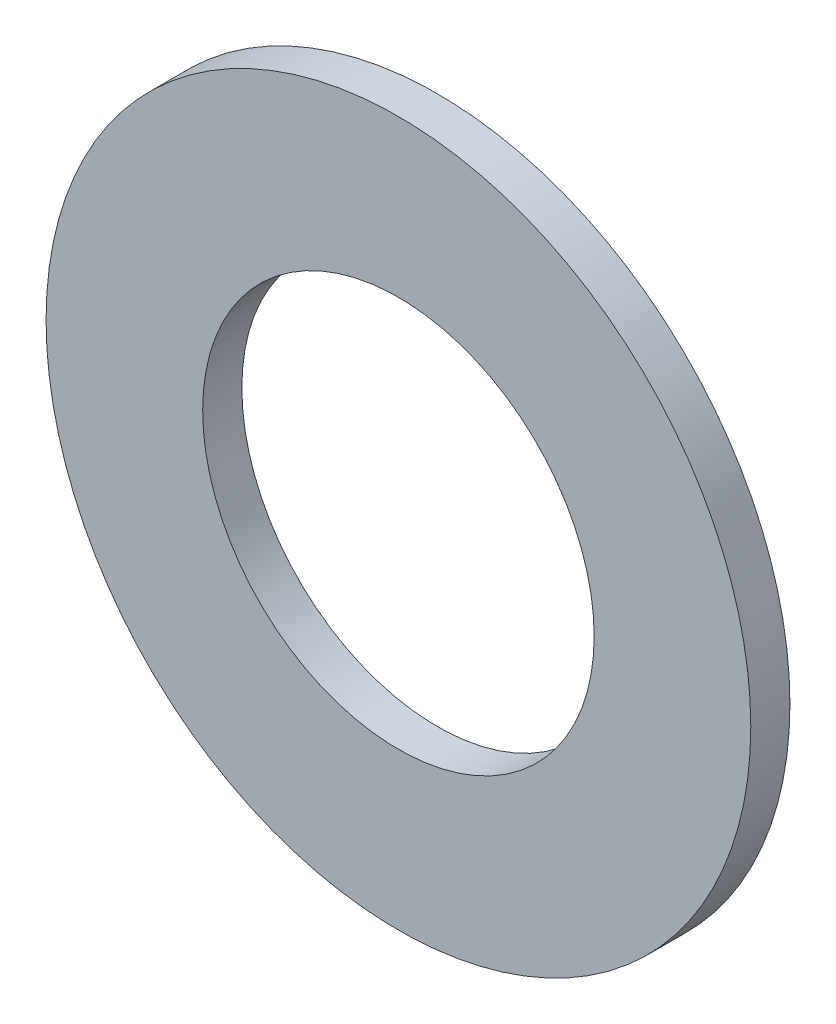
ISO-10303-21;
HEADER;
FILE_DESCRIPTION(('STEP AP214'),'2;1');
FILE_NAME('part.step','',(''),(''),'','','');
FILE_SCHEMA(('AUTOMOTIVE_DESIGN { 1 0 10303 214 1 1 1 1 }'));
ENDSEC;
DATA;
#1=APPLICATION_CONTEXT('core data for automotive mechanical design processes');
#2=APPLICATION_PROTOCOL_DEFINITION('international standard','automotive_design',2000,#1);
#3=PRODUCT_CONTEXT('',#1,'mechanical');
#4=PRODUCT('Part','Part','',(#3));
#5=PRODUCT_RELATED_PRODUCT_CATEGORY('part','',(#4));
#6=PRODUCT_DEFINITION_FORMATION('','',#4);
#7=PRODUCT_DEFINITION_CONTEXT('part definition',#1,'design');
#8=PRODUCT_DEFINITION('design','',#6,#7);
#9=PRODUCT_DEFINITION_SHAPE('','',#8);
#10=(LENGTH_UNIT() NAMED_UNIT(*) SI_UNIT(.MILLI.,.METRE.));
#11=(NAMED_UNIT(*) PLANE_ANGLE_UNIT() SI_UNIT($,.RADIAN.));
#12=(NAMED_UNIT(*) SI_UNIT($,.STERADIAN.) SOLID_ANGLE_UNIT());
#13=UNCERTAINTY_MEASURE_WITH_UNIT(LENGTH_MEASURE(1.E-05),#10,'distance_accuracy_value','');
#14=(GEOMETRIC_REPRESENTATION_CONTEXT(3) GLOBAL_UNCERTAINTY_ASSIGNED_CONTEXT((#13)) GLOBAL_UNIT_ASSIGNED_CONTEXT((#10,
#11,#12)) REPRESENTATION_CONTEXT('',''));
#15=CARTESIAN_POINT('',(0.,0.,0.));
#16=DIRECTION('',(0.,0.,1.));
#17=DIRECTION('',(1.,0.,0.));
#18=AXIS2_PLACEMENT_3D('',#15,#16,#17);
#19=CARTESIAN_POINT('',(0.,0.,-0.25));
#20=DIRECTION('',(0.,0.,1.));
#21=DIRECTION('',(1.,0.,0.));
#22=AXIS2_PLACEMENT_3D('',#19,#20,#21);
#23=PLANE('',#22);
#24=CARTESIAN_POINT('',(0.,0.,-0.25));
#25=DIRECTION('',(0.,0.,-1.));
#26=DIRECTION('',(-1.,0.,0.));
#27=AXIS2_PLACEMENT_3D('',#24,#25,#26);
#28=CIRCLE('',#27,2.5);
#29=CARTESIAN_POINT('',(-2.5,0.,-0.25));
#30=VERTEX_POINT('',#29);
#31=EDGE_CURVE('E26',#30,#30,#28,.F.);
#32=ORIENTED_EDGE('',*,*,#31,.T.);
#33=EDGE_LOOP('',(#32));
#34=FACE_BOUND('',#33,.T.);
#35=CARTESIAN_POINT('',(0.,0.,-0.25));
#36=DIRECTION('',(0.,0.,-1.));
#37=DIRECTION('',(-1.,0.,0.));
#38=AXIS2_PLACEMENT_3D('',#35,#36,#37);
#39=CIRCLE('',#38,4.5);
#40=CARTESIAN_POINT('',(-4.5,0.,-0.25));
#41=VERTEX_POINT('',#40);
#42=EDGE_CURVE('E17',#41,#41,#39,.F.);
#43=ORIENTED_EDGE('',*,*,#42,.F.);
#44=EDGE_LOOP('',(#43));
#45=FACE_BOUND('',#44,.T.);
#46=ADVANCED_FACE('F14',(#34,#45),#23,.F.);
#47=CARTESIAN_POINT('',(0.,0.,0.25));
#48=DIRECTION('',(0.,0.,-1.));
#49=DIRECTION('',(-1.,0.,0.));
#50=AXIS2_PLACEMENT_3D('',#47,#48,#49);
#51=CYLINDRICAL_SURFACE('',#50,4.5);
#52=ORIENTED_EDGE('',*,*,#42,.T.);
#53=EDGE_LOOP('',(#52));
#54=FACE_BOUND('',#53,.T.);
#55=CARTESIAN_POINT('',(0.,0.,0.25));
#56=DIRECTION('',(0.,0.,-1.));
#57=DIRECTION('',(-1.,0.,0.));
#58=AXIS2_PLACEMENT_3D('',#55,#56,#57);
#59=CIRCLE('',#58,4.5);
#60=CARTESIAN_POINT('',(-4.5,0.,0.25));
#61=VERTEX_POINT('',#60);
#62=EDGE_CURVE('E21',#61,#61,#59,.F.);
#63=ORIENTED_EDGE('',*,*,#62,.F.);
#64=EDGE_LOOP('',(#63));
#65=FACE_BOUND('',#64,.T.);
#66=ADVANCED_FACE('F34',(#54,#65),#51,.T.);
#67=CARTESIAN_POINT('',(0.,0.,0.25));
#68=DIRECTION('',(0.,0.,-1.));
#69=DIRECTION('',(-1.,0.,0.));
#70=AXIS2_PLACEMENT_3D('',#67,#68,#69);
#71=CYLINDRICAL_SURFACE('',#70,2.5);
#72=CARTESIAN_POINT('',(0.,0.,0.25));
#73=DIRECTION('',(0.,0.,-1.));
#74=DIRECTION('',(-1.,0.,0.));
#75=AXIS2_PLACEMENT_3D('',#72,#73,#74);
#76=CIRCLE('',#75,2.5);
#77=CARTESIAN_POINT('',(-2.5,0.,0.25));
#78=VERTEX_POINT('',#77);
#79=EDGE_CURVE('E9',#78,#78,#76,.T.);
#80=ORIENTED_EDGE('',*,*,#79,.F.);
#81=EDGE_LOOP('',(#80));
#82=FACE_BOUND('',#81,.T.);
#83=ORIENTED_EDGE('',*,*,#31,.F.);
#84=EDGE_LOOP('',(#83));
#85=FACE_BOUND('',#84,.T.);
#86=ADVANCED_FACE('F42',(#82,#85),#71,.F.);
#87=CARTESIAN_POINT('',(0.,0.,0.25));
#88=DIRECTION('',(0.,0.,1.));
#89=DIRECTION('',(1.,0.,0.));
#90=AXIS2_PLACEMENT_3D('',#87,#88,#89);
#91=PLANE('',#90);
#92=ORIENTED_EDGE('',*,*,#79,.T.);
#93=EDGE_LOOP('',(#92));
#94=FACE_BOUND('',#93,.T.);
#95=ORIENTED_EDGE('',*,*,#62,.T.);
#96=EDGE_LOOP('',(#95));
#97=FACE_BOUND('',#96,.T.);
#98=ADVANCED_FACE('F43',(#94,#97),#91,.T.);
#99=CLOSED_SHELL('',(#46,#66,#86,#98));
#100=MANIFOLD_SOLID_BREP('B1',#99);
#101=ADVANCED_BREP_SHAPE_REPRESENTATION('',(#18,#100),#14);
#102=SHAPE_DEFINITION_REPRESENTATION(#9,#101);
ENDSEC;
END-ISO-10303-21;
